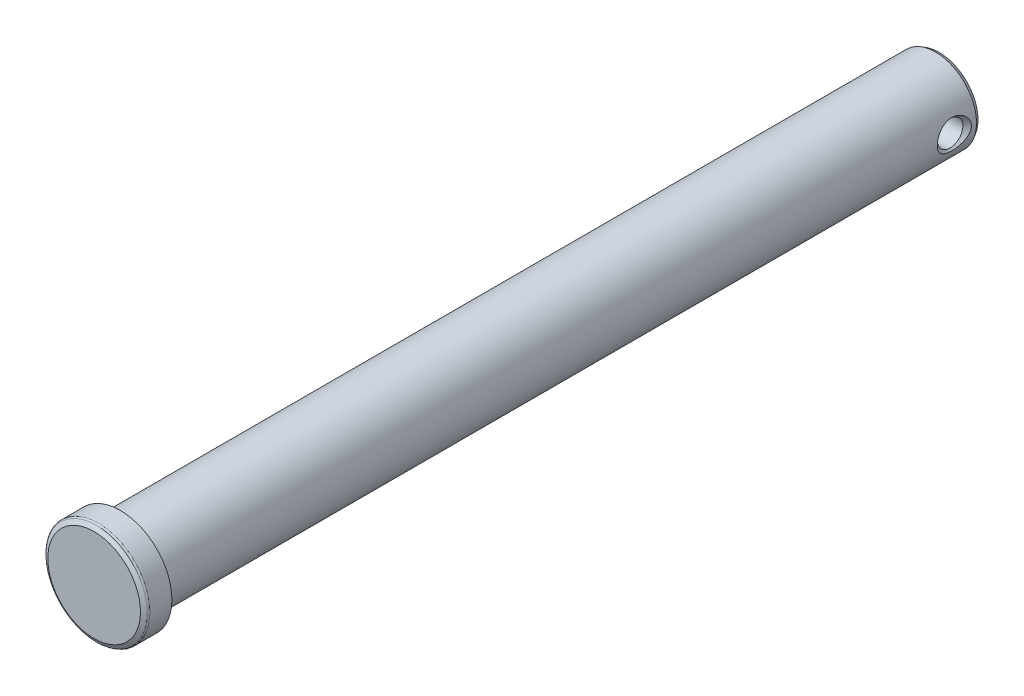
ISO-10303-21;
HEADER;
FILE_DESCRIPTION(('STEP AP214'),'2;1');
FILE_NAME('part.step','',(''),(''),'','','');
FILE_SCHEMA(('AUTOMOTIVE_DESIGN { 1 0 10303 214 1 1 1 1 }'));
ENDSEC;
DATA;
#1=APPLICATION_CONTEXT('core data for automotive mechanical design processes');
#2=APPLICATION_PROTOCOL_DEFINITION('international standard','automotive_design',2000,#1);
#3=PRODUCT_CONTEXT('',#1,'mechanical');
#4=PRODUCT('Part','Part','',(#3));
#5=PRODUCT_RELATED_PRODUCT_CATEGORY('part','',(#4));
#6=PRODUCT_DEFINITION_FORMATION('','',#4);
#7=PRODUCT_DEFINITION_CONTEXT('part definition',#1,'design');
#8=PRODUCT_DEFINITION('design','',#6,#7);
#9=PRODUCT_DEFINITION_SHAPE('','',#8);
#10=(LENGTH_UNIT() NAMED_UNIT(*) SI_UNIT(.MILLI.,.METRE.));
#11=(NAMED_UNIT(*) PLANE_ANGLE_UNIT() SI_UNIT($,.RADIAN.));
#12=(NAMED_UNIT(*) SI_UNIT($,.STERADIAN.) SOLID_ANGLE_UNIT());
#13=UNCERTAINTY_MEASURE_WITH_UNIT(LENGTH_MEASURE(1.E-05),#10,'distance_accuracy_value','');
#14=(GEOMETRIC_REPRESENTATION_CONTEXT(3) GLOBAL_UNCERTAINTY_ASSIGNED_CONTEXT((#13)) GLOBAL_UNIT_ASSIGNED_CONTEXT((#10,
#11,#12)) REPRESENTATION_CONTEXT('',''));
#15=CARTESIAN_POINT('',(0.,0.,0.));
#16=DIRECTION('',(0.,0.,1.));
#17=DIRECTION('',(1.,0.,0.));
#18=AXIS2_PLACEMENT_3D('',#15,#16,#17);
#19=CARTESIAN_POINT('',(0.,0.,63.5));
#20=DIRECTION('',(0.,0.,1.));
#21=DIRECTION('',(1.,0.,0.));
#22=AXIS2_PLACEMENT_3D('',#19,#20,#21);
#23=CYLINDRICAL_SURFACE('',#22,6.35);
#24=CARTESIAN_POINT('',(-6.08946556806022,-1.80025250879121,-61.0705851077294));
#25=CARTESIAN_POINT('',(-6.06500480892005,-1.88300294252602,-60.9376040751017));
#26=CARTESIAN_POINT('',(-6.04208780252657,-1.95438056437325,-60.7970543772474));
#27=CARTESIAN_POINT('',(-6.0022071070109,-2.07364131228931,-60.5052282418399));
#28=CARTESIAN_POINT('',(-5.98525978427759,-2.12145999025203,-60.353923661142));
#29=CARTESIAN_POINT('',(-5.9594412012259,-2.19294825097273,-60.0444373783609));
#30=CARTESIAN_POINT('',(-5.95059939854113,-2.21652978676401,-59.8862327637108));
#31=CARTESIAN_POINT('',(-5.94224537322893,-2.2388313936682,-59.5679736608714));
#32=CARTESIAN_POINT('',(-5.94272563163844,-2.23757150130075,-59.4079207676002));
#33=CARTESIAN_POINT('',(-5.95301173558374,-2.2100607324755,-59.0878458447917));
#34=CARTESIAN_POINT('',(-5.96295774711407,-2.18343422890581,-58.9278604929284));
#35=CARTESIAN_POINT('',(-5.99108067784824,-2.10503465023392,-58.6147948478071));
#36=CARTESIAN_POINT('',(-6.00926382107225,-2.05324255772765,-58.4617198724207));
#37=CARTESIAN_POINT('',(-6.05152450366875,-1.92512205377195,-58.1670084903579));
#38=CARTESIAN_POINT('',(-6.07560360888412,-1.8487871225745,-58.025375135645));
#39=CARTESIAN_POINT('',(-6.12653277477935,-1.67227347683414,-57.7584112427694));
#40=CARTESIAN_POINT('',(-6.1533796110556,-1.57212233424682,-57.6330621099863));
#41=CARTESIAN_POINT('',(-6.19998908606651,-1.37490911935274,-57.4307777616048));
#42=CARTESIAN_POINT('',(-6.21995373421023,-1.28249277250774,-57.349351027876));
#43=CARTESIAN_POINT('',(-6.25739264510909,-1.08517007903807,-57.2025438227951));
#44=CARTESIAN_POINT('',(-6.27486839322964,-0.980271251107546,-57.1371537638532));
#45=CARTESIAN_POINT('',(-6.30548318326387,-0.758910929136475,-57.0254038692047));
#46=CARTESIAN_POINT('',(-6.31858355851896,-0.642357589379462,-56.9792128707546));
#47=CARTESIAN_POINT('',(-6.33840122682047,-0.402025659880049,-56.9101311092041));
#48=CARTESIAN_POINT('',(-6.3451261630284,-0.278255911024465,-56.8872124438393));
#49=CARTESIAN_POINT('',(-6.35072723579668,-0.0467433764206145,-56.8681168317929));
#50=CARTESIAN_POINT('',(-6.35060520852393,0.060703596241719,-56.8685266489524));
#51=CARTESIAN_POINT('',(-6.34498911884112,0.273788077103968,-56.8876872425124));
#52=CARTESIAN_POINT('',(-6.33949588556502,0.379425862020839,-56.9064351881214));
#53=CARTESIAN_POINT('',(-6.32417756565913,0.580469698916779,-56.9596405265989));
#54=CARTESIAN_POINT('',(-6.31458758844322,0.676122816790439,-56.9932483452855));
#55=CARTESIAN_POINT('',(-6.29204970566504,0.860983601418237,-57.074165170811));
#56=CARTESIAN_POINT('',(-6.2791009947285,0.950189715708347,-57.1214774640965));
#57=CARTESIAN_POINT('',(-6.24946250639317,1.12951599782499,-57.2333344004952));
#58=CARTESIAN_POINT('',(-6.23252592691544,1.21880237139196,-57.2991440353825));
#59=CARTESIAN_POINT('',(-6.19728918701554,1.38690218777346,-57.4426604547941));
#60=CARTESIAN_POINT('',(-6.17898824777129,1.4657095762787,-57.520374061611));
#61=CARTESIAN_POINT('',(-6.13913686365532,1.62524078846704,-57.7001620747707));
#62=CARTESIAN_POINT('',(-6.11758305487082,1.7038473644036,-57.8041151526272));
#63=CARTESIAN_POINT('',(-6.0764153999034,1.84529361558585,-58.022594523765));
#64=CARTESIAN_POINT('',(-6.05680280863153,1.90812313147493,-58.1371275652363));
#65=CARTESIAN_POINT('',(-6.01845917586724,2.0261028027157,-58.3925726985284));
#66=CARTESIAN_POINT('',(-6.00033329120438,2.078563618698,-58.534825381669));
#67=CARTESIAN_POINT('',(-5.97099633519703,2.16139710993139,-58.8263028000725));
#68=CARTESIAN_POINT('',(-5.95978695701826,2.19176437699161,-58.9755292329041));
#69=CARTESIAN_POINT('',(-5.94516202384055,2.23115255724621,-59.2863956561424));
#70=CARTESIAN_POINT('',(-5.94225933620213,2.23877001127639,-59.4482402682001));
#71=CARTESIAN_POINT('',(-5.94610101898477,2.22854328247118,-59.7710031219965));
#72=CARTESIAN_POINT('',(-5.95284586651847,2.21069784038477,-59.9319213175246));
#73=CARTESIAN_POINT('',(-5.97511909577176,2.14976679229752,-60.2487475863668));
#74=CARTESIAN_POINT('',(-5.99067195482378,2.10661083680852,-60.404640412775));
#75=CARTESIAN_POINT('',(-6.02857982288002,1.99553332203209,-60.7066174397112));
#76=CARTESIAN_POINT('',(-6.05093966695412,1.92759415215533,-60.8526945777297));
#77=CARTESIAN_POINT('',(-6.09945399599868,1.76807007244952,-61.1295721195209));
#78=CARTESIAN_POINT('',(-6.12558665370246,1.67661896153771,-61.2604530739151));
#79=CARTESIAN_POINT('',(-6.1782403973682,1.47073550363506,-61.5025554266451));
#80=CARTESIAN_POINT('',(-6.20476068510954,1.35634551284692,-61.6138123589557));
#81=CARTESIAN_POINT('',(-6.24722726538169,1.14150892720777,-61.7827459673761));
#82=CARTESIAN_POINT('',(-6.26405280688227,1.04615300442206,-61.8466979073511));
#83=CARTESIAN_POINT('',(-6.29422437498016,0.845849711646499,-61.9584042775127));
#84=CARTESIAN_POINT('',(-6.30757331110262,0.740910461813067,-62.0061722619782));
#85=CARTESIAN_POINT('',(-6.32937545727361,0.523022314969421,-62.0830503040396));
#86=CARTESIAN_POINT('',(-6.33779464021358,0.410023650646076,-62.1120308267339));
#87=CARTESIAN_POINT('',(-6.34847673905213,0.180330946879259,-62.1486665383719));
#88=CARTESIAN_POINT('',(-6.35074333034458,0.0636391557823491,-62.1563344589601));
#89=CARTESIAN_POINT('',(-6.34892866518301,-0.155812740536088,-62.1501493854636));
#90=CARTESIAN_POINT('',(-6.34553766901893,-0.258653034809975,-62.1386367708582));
#91=CARTESIAN_POINT('',(-6.33406633574385,-0.460820581321473,-62.0991559544885));
#92=CARTESIAN_POINT('',(-6.32598614225238,-0.560147941053499,-62.071188256706));
#93=CARTESIAN_POINT('',(-6.30594374300713,-0.752996165373567,-62.000313121469));
#94=CARTESIAN_POINT('',(-6.29397610210368,-0.846508680692121,-61.9573847609307));
#95=CARTESIAN_POINT('',(-6.2672271323794,-1.02596917611207,-61.8585401872414));
#96=CARTESIAN_POINT('',(-6.25244376570881,-1.11191161116184,-61.8026145609714));
#97=CARTESIAN_POINT('',(-6.21909656985284,-1.28617283380978,-61.6714795187687));
#98=CARTESIAN_POINT('',(-6.20029178438864,-1.37324818408096,-61.594686449477));
#99=CARTESIAN_POINT('',(-6.16214963339903,-1.53536698073819,-61.4296294095048));
#100=CARTESIAN_POINT('',(-6.14281281527593,-1.61042228910788,-61.3413769053114));
#101=CARTESIAN_POINT('',(-6.11221857254795,-1.72198668265558,-61.1909271009807));
#102=CARTESIAN_POINT('',(-6.10067983343983,-1.76231479316832,-61.1315515144462));
#103=CARTESIAN_POINT('',(-6.08946556806022,-1.80025250879121,-61.0705851077294));
#104=B_SPLINE_CURVE_WITH_KNOTS('',3,(#24,#25,#26,#27,#28,#29,#30,#31,#32,#33,#34,#35,#36,#37,
#38,#39,#40,#41,#42,#43,#44,#45,#46,#47,#48,#49,#50,#51,#52,#53,#54,#55,#56,#57,#58,#59,#60,#61,
#62,#63,#64,#65,#66,#67,#68,#69,#70,#71,#72,#73,#74,#75,#76,#77,#78,#79,#80,#81,#82,#83,#84,#85,
#86,#87,#88,#89,#90,#91,#92,#93,#94,#95,#96,#97,#98,#99,#100,#101,#102,#103),.UNSPECIFIED.,.T.,
.F.,(4,2,2,2,2,2,2,2,2,2,2,2,2,2,2,2,2,2,2,2,2,2,2,2,2,2,2,2,2,2,2,2,2,2,2,2,2,2,2,4),(0.,
0.475345116727027,0.951983470667508,1.43034726725991,1.90832524250667,2.39349292021359,
2.87902780623024,3.36469178017719,3.84979621639681,4.2226716286508,4.59532356942102,
4.97118662303263,5.34659850325449,5.66724743669548,5.98784688051473,6.292102503239,
6.59643114947534,6.93178242409057,7.2673266161826,7.66210046034175,8.05712786393975,
8.513232506931,8.96944876041124,9.45328164912773,9.93713846631535,10.4223465593295,
10.9079001078781,11.3907494347638,11.8727152658358,12.2194746987905,12.5659429940092,
12.9147753878845,13.2633993527014,13.572515550398,13.8816222810624,14.1911630562254,
14.5009287152005,14.8524821484738,15.2036864843368,15.4216129295191),.UNSPECIFIED.);
#105=CARTESIAN_POINT('',(-6.08946556806022,-1.80025250879121,-61.0705851077294));
#106=VERTEX_POINT('',#105);
#107=EDGE_CURVE('E55',#106,#106,#104,.T.);
#108=ORIENTED_EDGE('',*,*,#107,.F.);
#109=EDGE_LOOP('',(#108));
#110=FACE_BOUND('',#109,.T.);
#111=CARTESIAN_POINT('',(0.,0.,63.1825));
#112=DIRECTION('',(0.,0.,1.));
#113=DIRECTION('',(1.,0.,0.));
#114=AXIS2_PLACEMENT_3D('',#111,#112,#113);
#115=CIRCLE('',#114,6.35);
#116=CARTESIAN_POINT('',(6.35,0.,63.1825));
#117=VERTEX_POINT('',#116);
#118=EDGE_CURVE('E10',#117,#117,#115,.F.);
#119=ORIENTED_EDGE('',*,*,#118,.T.);
#120=EDGE_LOOP('',(#119));
#121=FACE_BOUND('',#120,.T.);
#122=CARTESIAN_POINT('',(0.,0.,-62.9500738685969));
#123=DIRECTION('',(0.,0.,1.));
#124=DIRECTION('',(1.,0.,0.));
#125=AXIS2_PLACEMENT_3D('',#122,#123,#124);
#126=CIRCLE('',#125,6.35);
#127=CARTESIAN_POINT('',(6.35,0.,-62.9500738685969));
#128=VERTEX_POINT('',#127);
#129=EDGE_CURVE('E122',#128,#128,#126,.T.);
#130=ORIENTED_EDGE('',*,*,#129,.T.);
#131=EDGE_LOOP('',(#130));
#132=FACE_BOUND('',#131,.T.);
#133=CARTESIAN_POINT('',(6.21726314511694,-1.29156525429554,-61.6630724873706));
#134=CARTESIAN_POINT('',(6.23683266769621,-1.19735851998365,-61.742465582233));
#135=CARTESIAN_POINT('',(6.25554026937854,-1.09653399126455,-61.8144957655095));
#136=CARTESIAN_POINT('',(6.28919626448956,-0.883260253955591,-61.940247546781));
#137=CARTESIAN_POINT('',(6.30414077363251,-0.770799201594935,-61.9939502471881));
#138=CARTESIAN_POINT('',(6.32791644613328,-0.541126211020622,-62.0780014787915));
#139=CARTESIAN_POINT('',(6.33693855083019,-0.424206692678893,-62.10908337626));
#140=CARTESIAN_POINT('',(6.34837721412913,-0.186337411113739,-62.1483362445237));
#141=CARTESIAN_POINT('',(6.35080257069702,-0.0653932337682699,-62.1565377308926));
#142=CARTESIAN_POINT('',(6.34886768784672,0.1584289395842,-62.1499405298036));
#143=CARTESIAN_POINT('',(6.3454267296869,0.261421172541318,-62.1382581952574));
#144=CARTESIAN_POINT('',(6.33384578006214,0.463870923734274,-62.0983935533371));
#145=CARTESIAN_POINT('',(6.32570535924299,0.563328118118998,-62.0702097383447));
#146=CARTESIAN_POINT('',(6.30555161175437,0.756273086998906,-61.9989116777231));
#147=CARTESIAN_POINT('',(6.29353754551691,0.849759717489348,-61.9557945808702));
#148=CARTESIAN_POINT('',(6.26671158745199,1.0291074218931,-61.8566036712678));
#149=CARTESIAN_POINT('',(6.25189876337488,1.11496594087718,-61.8005255398807));
#150=CARTESIAN_POINT('',(6.21850264978681,1.28903395020913,-61.6690804737141));
#151=CARTESIAN_POINT('',(6.19968026967424,1.37599986646264,-61.5921323367551));
#152=CARTESIAN_POINT('',(6.16149377427786,1.5379967482674,-61.4266960877259));
#153=CARTESIAN_POINT('',(6.14212932083097,1.61302005932402,-61.3382006401062));
#154=CARTESIAN_POINT('',(6.10090344824407,1.76311947393585,-61.1350579199958));
#155=CARTESIAN_POINT('',(6.07922190635699,1.83576274846126,-61.0185730356313));
#156=CARTESIAN_POINT('',(6.03922975104414,1.96333312232884,-60.7757365102935));
#157=CARTESIAN_POINT('',(6.0209210502541,2.01825018286762,-60.6493793285196));
#158=CARTESIAN_POINT('',(5.98736955026179,2.11587644279734,-60.3727914939752));
#159=CARTESIAN_POINT('',(5.9728294877497,2.15608828455084,-60.2215867530419));
#160=CARTESIAN_POINT('',(5.95204268011393,2.21282734862985,-59.9142496427759));
#161=CARTESIAN_POINT('',(5.94579691327935,2.22935177710915,-59.7581166943979));
#162=CARTESIAN_POINT('',(5.94232176957624,2.23860470352548,-59.4397270171325));
#163=CARTESIAN_POINT('',(5.94540494007734,2.23050828413196,-59.27744198661));
#164=CARTESIAN_POINT('',(5.96086620192299,2.18884771978715,-58.9566140057515));
#165=CARTESIAN_POINT('',(5.97324560147691,2.15527999038558,-58.7980715853324));
#166=CARTESIAN_POINT('',(6.00568379176936,2.06316173392585,-58.4891542604806));
#167=CARTESIAN_POINT('',(6.02574617360741,2.00459952273965,-58.3387832130137));
#168=CARTESIAN_POINT('',(6.07099887046275,1.86305600920028,-58.0506355121098));
#169=CARTESIAN_POINT('',(6.09619282683014,1.78005734807941,-57.9128679031966));
#170=CARTESIAN_POINT('',(6.14784905719041,1.59239613787734,-57.6577179997432));
#171=CARTESIAN_POINT('',(6.17427325889713,1.48822866497641,-57.5399663224397));
#172=CARTESIAN_POINT('',(6.2251528175258,1.25844815662933,-57.3272315444102));
#173=CARTESIAN_POINT('',(6.24961299399452,1.13289013512633,-57.2321915021828));
#174=CARTESIAN_POINT('',(6.285854488127,0.905206679302597,-57.0965481062972));
#175=CARTESIAN_POINT('',(6.29921417428849,0.807914966354239,-57.0482053703837));
#176=CARTESIAN_POINT('',(6.32179432446654,0.606349697948142,-56.9678374529521));
#177=CARTESIAN_POINT('',(6.33101850339309,0.502082505705212,-56.9357976230912));
#178=CARTESIAN_POINT('',(6.34433511712538,0.288746630032824,-56.8898548646359));
#179=CARTESIAN_POINT('',(6.34840333019431,0.179657757022405,-56.8760375295924));
#180=CARTESIAN_POINT('',(6.35082125948297,-0.0393195061636321,-56.8678023937504));
#181=CARTESIAN_POINT('',(6.34917174472959,-0.14920778683616,-56.8733819840912));
#182=CARTESIAN_POINT('',(6.34070243748732,-0.357897088157661,-56.9023780568616));
#183=CARTESIAN_POINT('',(6.33428072514785,-0.456910501145852,-56.9244218342193));
#184=CARTESIAN_POINT('',(6.31739115303037,-0.649976435847118,-56.9834671581273));
#185=CARTESIAN_POINT('',(6.30692259027649,-0.744028092428933,-57.0204713034849));
#186=CARTESIAN_POINT('',(6.282260562091,-0.930036216337733,-57.1099442756327));
#187=CARTESIAN_POINT('',(6.26790168670416,-1.02162931897566,-57.1631173036342));
#188=CARTESIAN_POINT('',(6.23699253000857,-1.19594156898198,-57.2818632870075));
#189=CARTESIAN_POINT('',(6.2204412596183,-1.2786566804439,-57.347441844786));
#190=CARTESIAN_POINT('',(6.18365971438834,-1.44686019008814,-57.5002368278768));
#191=CARTESIAN_POINT('',(6.16326344413757,-1.53069051299958,-57.5892360383287));
#192=CARTESIAN_POINT('',(6.12294265282988,-1.68476276084173,-57.7783927073386));
#193=CARTESIAN_POINT('',(6.10301845560583,-1.75499558221252,-57.8785575711123));
#194=CARTESIAN_POINT('',(6.0619176133227,-1.89253345225245,-58.1059796337398));
#195=CARTESIAN_POINT('',(6.04112890348167,-1.95719000558237,-58.2349146887402));
#196=CARTESIAN_POINT('',(6.00453606884071,-2.06673287905057,-58.501596423327));
#197=CARTESIAN_POINT('',(5.98873418107635,-2.11161033006267,-58.6393470242421));
#198=CARTESIAN_POINT('',(5.96254167104705,-2.18455358597222,-58.9343146946902));
#199=CARTESIAN_POINT('',(5.9528358007234,-2.21053276100811,-59.0921141305703));
#200=CARTESIAN_POINT('',(5.9426949629251,-2.23765202056456,-59.410096821481));
#201=CARTESIAN_POINT('',(5.9422591481673,-2.23879437517091,-59.5702798573112));
#202=CARTESIAN_POINT('',(5.95076965633581,-2.2160755346819,-59.8908849327078));
#203=CARTESIAN_POINT('',(5.95984804695148,-2.19186238082333,-60.0512786359162));
#204=CARTESIAN_POINT('',(5.98641195213781,-2.11822717782312,-60.3656499758741));
#205=CARTESIAN_POINT('',(6.00390699606008,-2.06877655089385,-60.5196201246052));
#206=CARTESIAN_POINT('',(6.04507368459244,-1.94520707684641,-60.816712721186));
#207=CARTESIAN_POINT('',(6.06875494446815,-1.87104977817513,-60.9598178305722));
#208=CARTESIAN_POINT('',(6.1191720621633,-1.69888518808119,-61.2298969909469));
#209=CARTESIAN_POINT('',(6.14589679719266,-1.60096335138372,-61.356926412358));
#210=CARTESIAN_POINT('',(6.17989550596402,-1.46028672327185,-61.5066716757673));
#211=CARTESIAN_POINT('',(6.18747949669861,-1.42785302551401,-61.5392991001967));
#212=CARTESIAN_POINT('',(6.20250362417001,-1.36111062959847,-61.6026526097873));
#213=CARTESIAN_POINT('',(6.20994367341374,-1.32680083673011,-61.6333775620641));
#214=CARTESIAN_POINT('',(6.21726314511694,-1.29156525429554,-61.6630724873706));
#215=B_SPLINE_CURVE_WITH_KNOTS('',3,(#133,#134,#135,#136,#137,#138,#139,#140,#141,#142,#143,
#144,#145,#146,#147,#148,#149,#150,#151,#152,#153,#154,#155,#156,#157,#158,#159,#160,#161,#162,
#163,#164,#165,#166,#167,#168,#169,#170,#171,#172,#173,#174,#175,#176,#177,#178,#179,#180,#181,
#182,#183,#184,#185,#186,#187,#188,#189,#190,#191,#192,#193,#194,#195,#196,#197,#198,#199,#200,
#201,#202,#203,#204,#205,#206,#207,#208,#209,#210,#211,#212,#213,#214),.UNSPECIFIED.,.T.,.F.,(4,
2,2,2,2,2,2,2,2,2,2,2,2,2,2,2,2,2,2,2,2,2,2,2,2,2,2,2,2,2,2,2,2,2,2,2,2,2,2,2,4),(0.,
0.374054171863042,0.748492876316818,1.11017396099489,1.47137244095929,1.78100626415514,
2.09066838071963,2.40038965394665,2.71021427595442,3.06180841806314,3.4136270114143,
3.82892386406003,4.24445549884203,4.71372718755912,5.18305422065117,5.66827722322987,
6.15356852148569,6.63908692694508,7.12495106265884,7.60054384679248,8.07493143526203,
8.4019828958738,8.72873997588633,9.05702647582795,9.38526882338002,9.68883054550578,
9.99244502286168,10.3118499880308,10.6313995441212,11.0018647354012,11.3725771027664,
11.8079651589253,12.243548248839,12.7219559391151,13.2003199027368,13.685413160887,
14.1710569397828,14.6574600955229,15.1421394596318,15.2819622320371,15.4218674808917),.UNSPECIFIED.);
#216=CARTESIAN_POINT('',(6.21726314511694,-1.29156525429554,-61.6630724873706));
#217=VERTEX_POINT('',#216);
#218=EDGE_CURVE('E63',#217,#217,#215,.T.);
#219=ORIENTED_EDGE('',*,*,#218,.F.);
#220=EDGE_LOOP('',(#219));
#221=FACE_BOUND('',#220,.T.);
#222=ADVANCED_FACE('F37',(#110,#121,#132,#221),#23,.T.);
#223=CARTESIAN_POINT('',(0.,0.,-63.5));
#224=DIRECTION('',(0.,0.,1.));
#225=DIRECTION('',(1.,0.,0.));
#226=AXIS2_PLACEMENT_3D('',#223,#224,#225);
#227=CONICAL_SURFACE('',#226,6.0325,0.5235987755983);
#228=ORIENTED_EDGE('',*,*,#129,.F.);
#229=EDGE_LOOP('',(#228));
#230=FACE_BOUND('',#229,.T.);
#231=CARTESIAN_POINT('',(0.,0.,-63.5));
#232=DIRECTION('',(0.,0.,1.));
#233=DIRECTION('',(1.,0.,0.));
#234=AXIS2_PLACEMENT_3D('',#231,#232,#233);
#235=CIRCLE('',#234,6.0325);
#236=CARTESIAN_POINT('',(6.0325,0.,-63.5));
#237=VERTEX_POINT('',#236);
#238=EDGE_CURVE('E126',#237,#237,#235,.T.);
#239=ORIENTED_EDGE('',*,*,#238,.T.);
#240=EDGE_LOOP('',(#239));
#241=FACE_BOUND('',#240,.T.);
#242=ADVANCED_FACE('F106',(#230,#241),#227,.T.);
#243=CARTESIAN_POINT('',(0.,8.001,63.5));
#244=DIRECTION('',(0.,0.,1.));
#245=DIRECTION('',(1.,0.,0.));
#246=AXIS2_PLACEMENT_3D('',#243,#244,#245);
#247=PLANE('',#246);
#248=CARTESIAN_POINT('',(0.,0.,63.5));
#249=DIRECTION('',(0.,0.,1.));
#250=DIRECTION('',(1.,0.,0.));
#251=AXIS2_PLACEMENT_3D('',#248,#249,#250);
#252=CIRCLE('',#251,6.6675);
#253=CARTESIAN_POINT('',(6.6675,0.,63.5));
#254=VERTEX_POINT('',#253);
#255=EDGE_CURVE('E45',#254,#254,#252,.T.);
#256=ORIENTED_EDGE('',*,*,#255,.T.);
#257=EDGE_LOOP('',(#256));
#258=FACE_BOUND('',#257,.T.);
#259=CARTESIAN_POINT('',(0.,0.,63.5));
#260=DIRECTION('',(0.,0.,1.));
#261=DIRECTION('',(1.,0.,0.));
#262=AXIS2_PLACEMENT_3D('',#259,#260,#261);
#263=CIRCLE('',#262,8.001);
#264=CARTESIAN_POINT('',(8.001,0.,63.5));
#265=VERTEX_POINT('',#264);
#266=EDGE_CURVE('E132',#265,#265,#263,.T.);
#267=ORIENTED_EDGE('',*,*,#266,.F.);
#268=EDGE_LOOP('',(#267));
#269=FACE_BOUND('',#268,.T.);
#270=ADVANCED_FACE('F103',(#258,#269),#247,.F.);
#271=CARTESIAN_POINT('',(0.,0.,63.5));
#272=DIRECTION('',(0.,0.,1.));
#273=DIRECTION('',(1.,0.,0.));
#274=AXIS2_PLACEMENT_3D('',#271,#272,#273);
#275=CYLINDRICAL_SURFACE('',#274,8.001);
#276=CARTESIAN_POINT('',(0.,0.,66.911420990735));
#277=DIRECTION('',(0.,0.,-1.));
#278=DIRECTION('',(-1.,0.,0.));
#279=AXIS2_PLACEMENT_3D('',#276,#277,#278);
#280=CIRCLE('',#279,8.001);
#281=CARTESIAN_POINT('',(-8.001,0.,66.911420990735));
#282=VERTEX_POINT('',#281);
#283=EDGE_CURVE('E50',#282,#282,#280,.T.);
#284=ORIENTED_EDGE('',*,*,#283,.T.);
#285=EDGE_LOOP('',(#284));
#286=FACE_BOUND('',#285,.T.);
#287=ORIENTED_EDGE('',*,*,#266,.T.);
#288=EDGE_LOOP('',(#287));
#289=FACE_BOUND('',#288,.T.);
#290=ADVANCED_FACE('F100',(#286,#289),#275,.T.);
#291=CARTESIAN_POINT('',(0.,0.,67.0947297012027));
#292=DIRECTION('',(0.,0.,-1.));
#293=DIRECTION('',(-1.,0.,0.));
#294=AXIS2_PLACEMENT_3D('',#291,#292,#293);
#295=CONICAL_SURFACE('',#294,8.001,1.0471975511966);
#296=CARTESIAN_POINT('',(0.,0.,67.1863840564365));
#297=DIRECTION('',(0.,0.,1.));
#298=DIRECTION('',(1.,0.,0.));
#299=AXIS2_PLACEMENT_3D('',#296,#297,#298);
#300=CIRCLE('',#299,7.84225);
#301=CARTESIAN_POINT('',(7.84225,0.,67.1863840564365));
#302=VERTEX_POINT('',#301);
#303=EDGE_CURVE('E138',#302,#302,#300,.T.);
#304=ORIENTED_EDGE('',*,*,#303,.T.);
#305=EDGE_LOOP('',(#304));
#306=FACE_BOUND('',#305,.T.);
#307=CARTESIAN_POINT('',(0.,0.,67.564));
#308=DIRECTION('',(0.,0.,1.));
#309=DIRECTION('',(1.,0.,0.));
#310=AXIS2_PLACEMENT_3D('',#307,#308,#309);
#311=CIRCLE('',#310,7.1882);
#312=CARTESIAN_POINT('',(7.1882,0.,67.564));
#313=VERTEX_POINT('',#312);
#314=EDGE_CURVE('E128',#313,#313,#311,.T.);
#315=ORIENTED_EDGE('',*,*,#314,.F.);
#316=EDGE_LOOP('',(#315));
#317=FACE_BOUND('',#316,.T.);
#318=ADVANCED_FACE('F96',(#306,#317),#295,.T.);
#319=CARTESIAN_POINT('',(0.,0.,67.564));
#320=DIRECTION('',(0.,0.,-1.));
#321=DIRECTION('',(-1.,0.,0.));
#322=AXIS2_PLACEMENT_3D('',#319,#320,#321);
#323=PLANE('',#322);
#324=ORIENTED_EDGE('',*,*,#314,.T.);
#325=EDGE_LOOP('',(#324));
#326=FACE_BOUND('',#325,.T.);
#327=ADVANCED_FACE('F92',(#326),#323,.F.);
#328=CARTESIAN_POINT('',(0.,6.0325,-63.5));
#329=DIRECTION('',(0.,0.,1.));
#330=DIRECTION('',(1.,0.,0.));
#331=AXIS2_PLACEMENT_3D('',#328,#329,#330);
#332=PLANE('',#331);
#333=ORIENTED_EDGE('',*,*,#238,.F.);
#334=EDGE_LOOP('',(#333));
#335=FACE_BOUND('',#334,.T.);
#336=ADVANCED_FACE('F88',(#335),#332,.F.);
#337=CARTESIAN_POINT('',(0.,0.,66.911420990735));
#338=DIRECTION('',(0.,0.,-1.));
#339=DIRECTION('',(-1.,0.,0.));
#340=AXIS2_PLACEMENT_3D('',#337,#338,#339);
#341=TOROIDAL_SURFACE('',#340,7.6835,0.3175);
#342=ORIENTED_EDGE('',*,*,#283,.F.);
#343=EDGE_LOOP('',(#342));
#344=FACE_BOUND('',#343,.T.);
#345=ORIENTED_EDGE('',*,*,#303,.F.);
#346=EDGE_LOOP('',(#345));
#347=FACE_BOUND('',#346,.T.);
#348=ADVANCED_FACE('F91',(#344,#347),#341,.T.);
#349=CARTESIAN_POINT('',(0.,0.,63.1825));
#350=DIRECTION('',(0.,0.,1.));
#351=DIRECTION('',(1.,0.,0.));
#352=AXIS2_PLACEMENT_3D('',#349,#350,#351);
#353=TOROIDAL_SURFACE('',#352,6.6675,0.3175);
#354=ORIENTED_EDGE('',*,*,#118,.F.);
#355=EDGE_LOOP('',(#354));
#356=FACE_BOUND('',#355,.T.);
#357=ORIENTED_EDGE('',*,*,#255,.F.);
#358=EDGE_LOOP('',(#357));
#359=FACE_BOUND('',#358,.T.);
#360=ADVANCED_FACE('F39',(#356,#359),#353,.F.);
#361=CARTESIAN_POINT('',(-6.35,0.,-59.5122));
#362=DIRECTION('',(-1.,0.,0.));
#363=DIRECTION('',(0.,0.,1.));
#364=AXIS2_PLACEMENT_3D('',#361,#362,#363);
#365=CONICAL_SURFACE('',#364,2.64160000000001,0.785398163397453);
#366=CARTESIAN_POINT('',(-5.68959999999999,0.,-59.5122));
#367=DIRECTION('',(-1.,0.,0.));
#368=DIRECTION('',(0.,0.,1.));
#369=AXIS2_PLACEMENT_3D('',#366,#367,#368);
#370=CIRCLE('',#369,1.98119999999999);
#371=CARTESIAN_POINT('',(-5.68959999999999,0.,-57.531));
#372=VERTEX_POINT('',#371);
#373=EDGE_CURVE('E53',#372,#372,#370,.F.);
#374=ORIENTED_EDGE('',*,*,#373,.T.);
#375=EDGE_LOOP('',(#374));
#376=FACE_BOUND('',#375,.T.);
#377=ORIENTED_EDGE('',*,*,#107,.T.);
#378=EDGE_LOOP('',(#377));
#379=FACE_BOUND('',#378,.T.);
#380=ADVANCED_FACE('F78',(#376,#379),#365,.F.);
#381=CARTESIAN_POINT('',(3.70840000000001,0.,-59.5122));
#382=DIRECTION('',(1.,0.,0.));
#383=DIRECTION('',(0.,0.,-1.));
#384=AXIS2_PLACEMENT_3D('',#381,#382,#383);
#385=CONICAL_SURFACE('',#384,0.,0.785398163397452);
#386=CARTESIAN_POINT('',(5.68959999999999,0.,-59.5122));
#387=DIRECTION('',(1.,0.,0.));
#388=DIRECTION('',(0.,0.,-1.));
#389=AXIS2_PLACEMENT_3D('',#386,#387,#388);
#390=CIRCLE('',#389,1.98119999999999);
#391=CARTESIAN_POINT('',(5.68959999999999,0.,-61.4934));
#392=VERTEX_POINT('',#391);
#393=EDGE_CURVE('E41',#392,#392,#390,.F.);
#394=ORIENTED_EDGE('',*,*,#393,.T.);
#395=EDGE_LOOP('',(#394));
#396=FACE_BOUND('',#395,.T.);
#397=ORIENTED_EDGE('',*,*,#218,.T.);
#398=EDGE_LOOP('',(#397));
#399=FACE_BOUND('',#398,.T.);
#400=ADVANCED_FACE('F82',(#396,#399),#385,.F.);
#401=CARTESIAN_POINT('',(-8.001,0.,-59.5122));
#402=DIRECTION('',(1.,0.,0.));
#403=DIRECTION('',(0.,0.,-1.));
#404=AXIS2_PLACEMENT_3D('',#401,#402,#403);
#405=CYLINDRICAL_SURFACE('',#404,1.98119999999999);
#406=ORIENTED_EDGE('',*,*,#373,.F.);
#407=EDGE_LOOP('',(#406));
#408=FACE_BOUND('',#407,.T.);
#409=ORIENTED_EDGE('',*,*,#393,.F.);
#410=EDGE_LOOP('',(#409));
#411=FACE_BOUND('',#410,.T.);
#412=ADVANCED_FACE('F84',(#408,#411),#405,.F.);
#413=CLOSED_SHELL('',(#222,#242,#270,#290,#318,#327,#336,#348,#360,#380,#400,#412));
#414=MANIFOLD_SOLID_BREP('B2',#413);
#415=ADVANCED_BREP_SHAPE_REPRESENTATION('',(#18,#414),#14);
#416=SHAPE_DEFINITION_REPRESENTATION(#9,#415);
ENDSEC;
END-ISO-10303-21;
